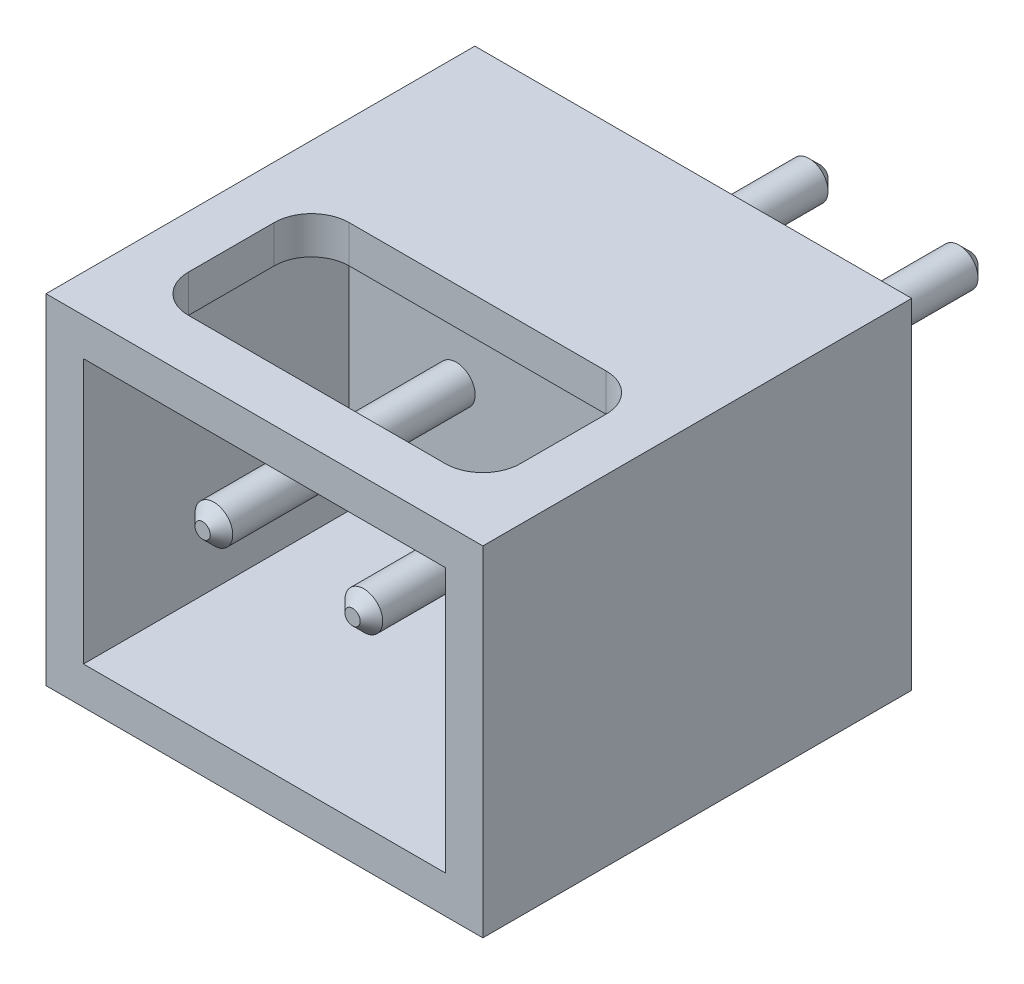
ISO-10303-21;
HEADER;
FILE_DESCRIPTION(('STEP AP214'),'2;1');
FILE_NAME('part.step','',(''),(''),'','','');
FILE_SCHEMA(('AUTOMOTIVE_DESIGN { 1 0 10303 214 1 1 1 1 }'));
ENDSEC;
DATA;
#1=APPLICATION_CONTEXT('core data for automotive mechanical design processes');
#2=APPLICATION_PROTOCOL_DEFINITION('international standard','automotive_design',2000,#1);
#3=PRODUCT_CONTEXT('',#1,'mechanical');
#4=PRODUCT('Part','Part','',(#3));
#5=PRODUCT_RELATED_PRODUCT_CATEGORY('part','',(#4));
#6=PRODUCT_DEFINITION_FORMATION('','',#4);
#7=PRODUCT_DEFINITION_CONTEXT('part definition',#1,'design');
#8=PRODUCT_DEFINITION('design','',#6,#7);
#9=PRODUCT_DEFINITION_SHAPE('','',#8);
#10=(LENGTH_UNIT() NAMED_UNIT(*) SI_UNIT(.MILLI.,.METRE.));
#11=(NAMED_UNIT(*) PLANE_ANGLE_UNIT() SI_UNIT($,.RADIAN.));
#12=(NAMED_UNIT(*) SI_UNIT($,.STERADIAN.) SOLID_ANGLE_UNIT());
#13=UNCERTAINTY_MEASURE_WITH_UNIT(LENGTH_MEASURE(1.E-05),#10,'distance_accuracy_value','');
#14=(GEOMETRIC_REPRESENTATION_CONTEXT(3) GLOBAL_UNCERTAINTY_ASSIGNED_CONTEXT((#13)) GLOBAL_UNIT_ASSIGNED_CONTEXT((#10,
#11,#12)) REPRESENTATION_CONTEXT('',''));
#15=CARTESIAN_POINT('',(0.,0.,0.));
#16=DIRECTION('',(0.,0.,1.));
#17=DIRECTION('',(1.,0.,0.));
#18=AXIS2_PLACEMENT_3D('',#15,#16,#17);
#19=CARTESIAN_POINT('',(0.,0.,7.0612));
#20=DIRECTION('',(0.,0.,1.));
#21=DIRECTION('',(1.,0.,0.));
#22=AXIS2_PLACEMENT_3D('',#19,#20,#21);
#23=PLANE('',#22);
#24=CARTESIAN_POINT('',(2.54,0.,7.0612));
#25=DIRECTION('',(0.,0.,1.));
#26=DIRECTION('',(1.,0.,0.));
#27=AXIS2_PLACEMENT_3D('',#24,#25,#26);
#28=CIRCLE('',#27,0.129495764106895);
#29=CARTESIAN_POINT('',(2.6694957641069,0.,7.0612));
#30=VERTEX_POINT('',#29);
#31=EDGE_CURVE('E19',#30,#30,#28,.F.);
#32=ORIENTED_EDGE('',*,*,#31,.F.);
#33=EDGE_LOOP('',(#32));
#34=FACE_BOUND('',#33,.T.);
#35=ADVANCED_FACE('F16',(#34),#23,.T.);
#36=CARTESIAN_POINT('',(0.,0.,7.0612));
#37=DIRECTION('',(0.,0.,1.));
#38=DIRECTION('',(1.,0.,0.));
#39=AXIS2_PLACEMENT_3D('',#36,#37,#38);
#40=PLANE('',#39);
#41=CARTESIAN_POINT('',(0.,0.,7.0612));
#42=DIRECTION('',(0.,0.,1.));
#43=DIRECTION('',(1.,0.,0.));
#44=AXIS2_PLACEMENT_3D('',#41,#42,#43);
#45=CIRCLE('',#44,0.129495764106895);
#46=CARTESIAN_POINT('',(0.129495764106895,0.,7.0612));
#47=VERTEX_POINT('',#46);
#48=EDGE_CURVE('E231',#47,#47,#45,.F.);
#49=ORIENTED_EDGE('',*,*,#48,.F.);
#50=EDGE_LOOP('',(#49));
#51=FACE_BOUND('',#50,.T.);
#52=ADVANCED_FACE('F241',(#51),#40,.T.);
#53=CARTESIAN_POINT('',(2.54,0.,6.87069476708757));
#54=DIRECTION('',(0.,0.,-1.));
#55=DIRECTION('',(-1.,0.,0.));
#56=AXIS2_PLACEMENT_3D('',#53,#54,#55);
#57=CONICAL_SURFACE('',#56,0.31999476573219,0.785381808494881);
#58=CARTESIAN_POINT('',(2.54,0.,6.87068953264856));
#59=DIRECTION('',(0.,0.,-1.));
#60=DIRECTION('',(-1.,0.,0.));
#61=AXIS2_PLACEMENT_3D('',#58,#59,#60);
#62=CIRCLE('',#61,0.31999999999999);
#63=CARTESIAN_POINT('',(2.22000000000001,0.,6.87068953264856));
#64=VERTEX_POINT('',#63);
#65=EDGE_CURVE('E229',#64,#64,#62,.T.);
#66=ORIENTED_EDGE('',*,*,#65,.F.);
#67=EDGE_LOOP('',(#66));
#68=FACE_BOUND('',#67,.T.);
#69=ORIENTED_EDGE('',*,*,#31,.T.);
#70=EDGE_LOOP('',(#69));
#71=FACE_BOUND('',#70,.T.);
#72=ADVANCED_FACE('F238',(#68,#71),#57,.T.);
#73=CARTESIAN_POINT('',(0.,0.,6.87069476708757));
#74=DIRECTION('',(0.,0.,-1.));
#75=DIRECTION('',(-1.,0.,0.));
#76=AXIS2_PLACEMENT_3D('',#73,#74,#75);
#77=CONICAL_SURFACE('',#76,0.31999476573219,0.785381808494881);
#78=CARTESIAN_POINT('',(0.,0.,6.87068953264856));
#79=DIRECTION('',(0.,0.,-1.));
#80=DIRECTION('',(-1.,0.,0.));
#81=AXIS2_PLACEMENT_3D('',#78,#79,#80);
#82=CIRCLE('',#81,0.31999999999999);
#83=CARTESIAN_POINT('',(-0.31999999999999,0.,6.87068953264856));
#84=VERTEX_POINT('',#83);
#85=EDGE_CURVE('E226',#84,#84,#82,.T.);
#86=ORIENTED_EDGE('',*,*,#85,.F.);
#87=EDGE_LOOP('',(#86));
#88=FACE_BOUND('',#87,.T.);
#89=ORIENTED_EDGE('',*,*,#48,.T.);
#90=EDGE_LOOP('',(#89));
#91=FACE_BOUND('',#90,.T.);
#92=ADVANCED_FACE('F350',(#88,#91),#77,.T.);
#93=CARTESIAN_POINT('',(2.54,0.,-3.4036));
#94=DIRECTION('',(0.,0.,1.));
#95=DIRECTION('',(1.,0.,0.));
#96=AXIS2_PLACEMENT_3D('',#93,#94,#95);
#97=CYLINDRICAL_SURFACE('',#96,0.31999999999999);
#98=ORIENTED_EDGE('',*,*,#65,.T.);
#99=EDGE_LOOP('',(#98));
#100=FACE_BOUND('',#99,.T.);
#101=CARTESIAN_POINT('',(2.54,0.,2.764282));
#102=DIRECTION('',(0.,0.,1.));
#103=DIRECTION('',(1.,0.,0.));
#104=AXIS2_PLACEMENT_3D('',#101,#102,#103);
#105=CIRCLE('',#104,0.31999999999999);
#106=CARTESIAN_POINT('',(2.85999999999999,0.,2.764282));
#107=VERTEX_POINT('',#106);
#108=EDGE_CURVE('E223',#107,#107,#105,.F.);
#109=ORIENTED_EDGE('',*,*,#108,.F.);
#110=EDGE_LOOP('',(#109));
#111=FACE_BOUND('',#110,.T.);
#112=ADVANCED_FACE('F346',(#100,#111),#97,.T.);
#113=CARTESIAN_POINT('',(0.,0.,-3.4036));
#114=DIRECTION('',(0.,0.,1.));
#115=DIRECTION('',(1.,0.,0.));
#116=AXIS2_PLACEMENT_3D('',#113,#114,#115);
#117=CYLINDRICAL_SURFACE('',#116,0.31999999999999);
#118=ORIENTED_EDGE('',*,*,#85,.T.);
#119=EDGE_LOOP('',(#118));
#120=FACE_BOUND('',#119,.T.);
#121=CARTESIAN_POINT('',(0.,0.,2.764282));
#122=DIRECTION('',(0.,0.,1.));
#123=DIRECTION('',(1.,0.,0.));
#124=AXIS2_PLACEMENT_3D('',#121,#122,#123);
#125=CIRCLE('',#124,0.31999999999999);
#126=CARTESIAN_POINT('',(0.31999999999999,0.,2.764282));
#127=VERTEX_POINT('',#126);
#128=EDGE_CURVE('E179',#127,#127,#125,.F.);
#129=ORIENTED_EDGE('',*,*,#128,.F.);
#130=EDGE_LOOP('',(#129));
#131=FACE_BOUND('',#130,.T.);
#132=ADVANCED_FACE('F342',(#120,#131),#117,.T.);
#133=CARTESIAN_POINT('',(0.,0.,-3.4036));
#134=DIRECTION('',(0.,0.,1.));
#135=DIRECTION('',(1.,0.,0.));
#136=AXIS2_PLACEMENT_3D('',#133,#134,#135);
#137=PLANE('',#136);
#138=CARTESIAN_POINT('',(2.54,0.,-3.4036));
#139=DIRECTION('',(0.,0.,1.));
#140=DIRECTION('',(1.,0.,0.));
#141=AXIS2_PLACEMENT_3D('',#138,#139,#140);
#142=CIRCLE('',#141,0.129495764110078);
#143=CARTESIAN_POINT('',(2.66949576411008,0.,-3.4036));
#144=VERTEX_POINT('',#143);
#145=EDGE_CURVE('E149',#144,#144,#142,.T.);
#146=ORIENTED_EDGE('',*,*,#145,.F.);
#147=EDGE_LOOP('',(#146));
#148=FACE_BOUND('',#147,.T.);
#149=ADVANCED_FACE('F338',(#148),#137,.F.);
#150=CARTESIAN_POINT('',(0.,0.,-3.4036));
#151=DIRECTION('',(0.,0.,1.));
#152=DIRECTION('',(1.,0.,0.));
#153=AXIS2_PLACEMENT_3D('',#150,#151,#152);
#154=PLANE('',#153);
#155=CARTESIAN_POINT('',(0.,0.,-3.4036));
#156=DIRECTION('',(0.,0.,1.));
#157=DIRECTION('',(1.,0.,0.));
#158=AXIS2_PLACEMENT_3D('',#155,#156,#157);
#159=CIRCLE('',#158,0.129495764110078);
#160=CARTESIAN_POINT('',(0.129495764110078,0.,-3.4036));
#161=VERTEX_POINT('',#160);
#162=EDGE_CURVE('E165',#161,#161,#159,.T.);
#163=ORIENTED_EDGE('',*,*,#162,.F.);
#164=EDGE_LOOP('',(#163));
#165=FACE_BOUND('',#164,.T.);
#166=ADVANCED_FACE('F334',(#165),#154,.F.);
#167=CARTESIAN_POINT('',(0.,0.,2.764282));
#168=DIRECTION('',(0.,0.,1.));
#169=DIRECTION('',(1.,0.,0.));
#170=AXIS2_PLACEMENT_3D('',#167,#168,#169);
#171=PLANE('',#170);
#172=ORIENTED_EDGE('',*,*,#128,.T.);
#173=EDGE_LOOP('',(#172));
#174=FACE_BOUND('',#173,.T.);
#175=ORIENTED_EDGE('',*,*,#108,.T.);
#176=EDGE_LOOP('',(#175));
#177=FACE_BOUND('',#176,.T.);
#178=DIRECTION('',(1.,0.,0.));
#179=VECTOR('',#178,1.);
#180=CARTESIAN_POINT('',(4.31500000000052,1.715,2.764282));
#181=LINE('',#180,#179);
#182=CARTESIAN_POINT('',(4.31500000000052,1.715,2.764282));
#183=VERTEX_POINT('',#182);
#184=CARTESIAN_POINT('',(-1.81500000000011,1.715,2.764282));
#185=VERTEX_POINT('',#184);
#186=EDGE_CURVE('E164',#183,#185,#181,.F.);
#187=ORIENTED_EDGE('',*,*,#186,.T.);
#188=DIRECTION('',(0.,1.,0.));
#189=VECTOR('',#188,1.);
#190=CARTESIAN_POINT('',(-1.81500000000011,1.715,2.764282));
#191=LINE('',#190,#189);
#192=CARTESIAN_POINT('',(-1.81500000000011,-2.7649999999991,2.764282));
#193=VERTEX_POINT('',#192);
#194=EDGE_CURVE('E367',#185,#193,#191,.F.);
#195=ORIENTED_EDGE('',*,*,#194,.T.);
#196=DIRECTION('',(1.,0.,0.));
#197=VECTOR('',#196,1.);
#198=CARTESIAN_POINT('',(-1.81500000000011,-2.7649999999991,2.764282));
#199=LINE('',#198,#197);
#200=CARTESIAN_POINT('',(4.31500000000052,-2.7649999999991,2.764282));
#201=VERTEX_POINT('',#200);
#202=EDGE_CURVE('E385',#193,#201,#199,.T.);
#203=ORIENTED_EDGE('',*,*,#202,.T.);
#204=DIRECTION('',(0.,1.,0.));
#205=VECTOR('',#204,1.);
#206=CARTESIAN_POINT('',(4.31500000000052,-2.7649999999991,2.764282));
#207=LINE('',#206,#205);
#208=EDGE_CURVE('E213',#201,#183,#207,.T.);
#209=ORIENTED_EDGE('',*,*,#208,.T.);
#210=EDGE_LOOP('',(#187,#195,#203,#209));
#211=FACE_BOUND('',#210,.T.);
#212=ADVANCED_FACE('F330',(#174,#177,#211),#171,.T.);
#213=CARTESIAN_POINT('',(-0.926000000000106,2.36859161005242,5.7404));
#214=DIRECTION('',(0.,-1.,0.));
#215=DIRECTION('',(0.,0.,-1.));
#216=AXIS2_PLACEMENT_3D('',#213,#214,#215);
#217=CYLINDRICAL_SURFACE('',#216,0.635);
#218=DIRECTION('',(0.,1.,0.));
#219=VECTOR('',#218,1.);
#220=CARTESIAN_POINT('',(-1.56100000000011,2.35,5.7404));
#221=LINE('',#220,#219);
#222=CARTESIAN_POINT('',(-1.56100000000011,1.715,5.7404));
#223=VERTEX_POINT('',#222);
#224=CARTESIAN_POINT('',(-1.56100000000011,2.35,5.7404));
#225=VERTEX_POINT('',#224);
#226=EDGE_CURVE('E177',#223,#225,#221,.T.);
#227=ORIENTED_EDGE('',*,*,#226,.T.);
#228=CARTESIAN_POINT('',(-0.926000000000106,2.35,5.7404));
#229=DIRECTION('',(0.,-1.,0.));
#230=DIRECTION('',(0.,0.,-1.));
#231=AXIS2_PLACEMENT_3D('',#228,#229,#230);
#232=CIRCLE('',#231,0.635);
#233=CARTESIAN_POINT('',(-0.926000000000106,2.35,6.3754));
#234=VERTEX_POINT('',#233);
#235=EDGE_CURVE('E206',#234,#225,#232,.T.);
#236=ORIENTED_EDGE('',*,*,#235,.F.);
#237=DIRECTION('',(0.,1.,0.));
#238=VECTOR('',#237,1.);
#239=CARTESIAN_POINT('',(-0.926000000000106,2.35,6.3754));
#240=LINE('',#239,#238);
#241=CARTESIAN_POINT('',(-0.926000000000106,1.715,6.3754));
#242=VERTEX_POINT('',#241);
#243=EDGE_CURVE('E150',#234,#242,#240,.F.);
#244=ORIENTED_EDGE('',*,*,#243,.T.);
#245=CARTESIAN_POINT('',(-0.926000000000106,1.715,5.7404));
#246=DIRECTION('',(0.,-1.,0.));
#247=DIRECTION('',(0.,0.,-1.));
#248=AXIS2_PLACEMENT_3D('',#245,#246,#247);
#249=CIRCLE('',#248,0.635);
#250=EDGE_CURVE('E156',#242,#223,#249,.T.);
#251=ORIENTED_EDGE('',*,*,#250,.T.);
#252=EDGE_LOOP('',(#227,#236,#244,#251));
#253=FACE_BOUND('',#252,.T.);
#254=ADVANCED_FACE('F326',(#253),#217,.F.);
#255=CARTESIAN_POINT('',(-1.56100000000011,2.35,3.653282));
#256=DIRECTION('',(-1.,0.,0.));
#257=DIRECTION('',(0.,0.,1.));
#258=AXIS2_PLACEMENT_3D('',#255,#256,#257);
#259=PLANE('',#258);
#260=DIRECTION('',(0.,-1.,0.));
#261=VECTOR('',#260,1.);
#262=CARTESIAN_POINT('',(-1.56100000000011,2.36859161005242,4.288282));
#263=LINE('',#262,#261);
#264=CARTESIAN_POINT('',(-1.56100000000011,1.715,4.288282));
#265=VERTEX_POINT('',#264);
#266=CARTESIAN_POINT('',(-1.56100000000011,2.35,4.288282));
#267=VERTEX_POINT('',#266);
#268=EDGE_CURVE('E175',#265,#267,#263,.F.);
#269=ORIENTED_EDGE('',*,*,#268,.T.);
#270=DIRECTION('',(0.,0.,1.));
#271=VECTOR('',#270,1.);
#272=CARTESIAN_POINT('',(-1.56100000000011,2.35,0.));
#273=LINE('',#272,#271);
#274=EDGE_CURVE('E205',#225,#267,#273,.F.);
#275=ORIENTED_EDGE('',*,*,#274,.F.);
#276=ORIENTED_EDGE('',*,*,#226,.F.);
#277=DIRECTION('',(0.,0.,1.));
#278=VECTOR('',#277,1.);
#279=CARTESIAN_POINT('',(-1.56100000000011,1.715,7.2644));
#280=LINE('',#279,#278);
#281=EDGE_CURVE('E158',#223,#265,#280,.F.);
#282=ORIENTED_EDGE('',*,*,#281,.T.);
#283=EDGE_LOOP('',(#269,#275,#276,#282));
#284=FACE_BOUND('',#283,.T.);
#285=ADVANCED_FACE('F322',(#284),#259,.F.);
#286=CARTESIAN_POINT('',(-0.926000000000106,2.36859161005242,4.288282));
#287=DIRECTION('',(0.,-1.,0.));
#288=DIRECTION('',(0.,0.,-1.));
#289=AXIS2_PLACEMENT_3D('',#286,#287,#288);
#290=CYLINDRICAL_SURFACE('',#289,0.635);
#291=DIRECTION('',(0.,1.,0.));
#292=VECTOR('',#291,1.);
#293=CARTESIAN_POINT('',(-0.926000000000106,2.35,3.653282));
#294=LINE('',#293,#292);
#295=CARTESIAN_POINT('',(-0.926000000000106,1.715,3.653282));
#296=VERTEX_POINT('',#295);
#297=CARTESIAN_POINT('',(-0.926000000000106,2.35,3.653282));
#298=VERTEX_POINT('',#297);
#299=EDGE_CURVE('E173',#296,#298,#294,.T.);
#300=ORIENTED_EDGE('',*,*,#299,.T.);
#301=CARTESIAN_POINT('',(-0.926000000000106,2.35,4.288282));
#302=DIRECTION('',(0.,-1.,0.));
#303=DIRECTION('',(0.,0.,-1.));
#304=AXIS2_PLACEMENT_3D('',#301,#302,#303);
#305=CIRCLE('',#304,0.635);
#306=EDGE_CURVE('E202',#267,#298,#305,.T.);
#307=ORIENTED_EDGE('',*,*,#306,.F.);
#308=ORIENTED_EDGE('',*,*,#268,.F.);
#309=CARTESIAN_POINT('',(-0.926000000000106,1.715,4.288282));
#310=DIRECTION('',(0.,-1.,0.));
#311=DIRECTION('',(0.,0.,-1.));
#312=AXIS2_PLACEMENT_3D('',#309,#310,#311);
#313=CIRCLE('',#312,0.635);
#314=EDGE_CURVE('E215',#265,#296,#313,.T.);
#315=ORIENTED_EDGE('',*,*,#314,.T.);
#316=EDGE_LOOP('',(#300,#307,#308,#315));
#317=FACE_BOUND('',#316,.T.);
#318=ADVANCED_FACE('F318',(#317),#290,.F.);
#319=CARTESIAN_POINT('',(4.06100000000052,2.35,3.653282));
#320=DIRECTION('',(0.,0.,-1.));
#321=DIRECTION('',(-1.,0.,0.));
#322=AXIS2_PLACEMENT_3D('',#319,#320,#321);
#323=PLANE('',#322);
#324=ORIENTED_EDGE('',*,*,#299,.F.);
#325=DIRECTION('',(1.,0.,0.));
#326=VECTOR('',#325,1.);
#327=CARTESIAN_POINT('',(4.31500000000052,1.715,3.653282));
#328=LINE('',#327,#326);
#329=CARTESIAN_POINT('',(3.42600000000052,1.715,3.653282));
#330=VERTEX_POINT('',#329);
#331=EDGE_CURVE('E214',#296,#330,#328,.T.);
#332=ORIENTED_EDGE('',*,*,#331,.T.);
#333=DIRECTION('',(0.,-1.,0.));
#334=VECTOR('',#333,1.);
#335=CARTESIAN_POINT('',(3.42600000000052,2.36859161005242,3.653282));
#336=LINE('',#335,#334);
#337=CARTESIAN_POINT('',(3.42600000000052,2.35,3.653282));
#338=VERTEX_POINT('',#337);
#339=EDGE_CURVE('E171',#330,#338,#336,.F.);
#340=ORIENTED_EDGE('',*,*,#339,.T.);
#341=DIRECTION('',(1.,0.,0.));
#342=VECTOR('',#341,1.);
#343=CARTESIAN_POINT('',(4.95000000000052,2.35,3.653282));
#344=LINE('',#343,#342);
#345=EDGE_CURVE('E201',#298,#338,#344,.T.);
#346=ORIENTED_EDGE('',*,*,#345,.F.);
#347=EDGE_LOOP('',(#324,#332,#340,#346));
#348=FACE_BOUND('',#347,.T.);
#349=ADVANCED_FACE('F314',(#348),#323,.F.);
#350=CARTESIAN_POINT('',(3.42600000000052,2.36859161005242,4.288282));
#351=DIRECTION('',(0.,-1.,0.));
#352=DIRECTION('',(0.,0.,-1.));
#353=AXIS2_PLACEMENT_3D('',#350,#351,#352);
#354=CYLINDRICAL_SURFACE('',#353,0.635);
#355=DIRECTION('',(0.,1.,0.));
#356=VECTOR('',#355,1.);
#357=CARTESIAN_POINT('',(4.06100000000052,2.35,4.288282));
#358=LINE('',#357,#356);
#359=CARTESIAN_POINT('',(4.06100000000052,1.715,4.288282));
#360=VERTEX_POINT('',#359);
#361=CARTESIAN_POINT('',(4.06100000000052,2.35,4.288282));
#362=VERTEX_POINT('',#361);
#363=EDGE_CURVE('E169',#360,#362,#358,.T.);
#364=ORIENTED_EDGE('',*,*,#363,.T.);
#365=CARTESIAN_POINT('',(3.42600000000052,2.35,4.288282));
#366=DIRECTION('',(0.,-1.,0.));
#367=DIRECTION('',(0.,0.,-1.));
#368=AXIS2_PLACEMENT_3D('',#365,#366,#367);
#369=CIRCLE('',#368,0.635);
#370=EDGE_CURVE('E198',#338,#362,#369,.T.);
#371=ORIENTED_EDGE('',*,*,#370,.F.);
#372=ORIENTED_EDGE('',*,*,#339,.F.);
#373=CARTESIAN_POINT('',(3.42600000000052,1.715,4.288282));
#374=DIRECTION('',(0.,-1.,0.));
#375=DIRECTION('',(0.,0.,-1.));
#376=AXIS2_PLACEMENT_3D('',#373,#374,#375);
#377=CIRCLE('',#376,0.635);
#378=EDGE_CURVE('E210',#330,#360,#377,.T.);
#379=ORIENTED_EDGE('',*,*,#378,.T.);
#380=EDGE_LOOP('',(#364,#371,#372,#379));
#381=FACE_BOUND('',#380,.T.);
#382=ADVANCED_FACE('F311',(#381),#354,.F.);
#383=CARTESIAN_POINT('',(4.06100000000052,2.35,6.3754));
#384=DIRECTION('',(1.,0.,0.));
#385=DIRECTION('',(0.,0.,-1.));
#386=AXIS2_PLACEMENT_3D('',#383,#384,#385);
#387=PLANE('',#386);
#388=ORIENTED_EDGE('',*,*,#363,.F.);
#389=DIRECTION('',(0.,0.,1.));
#390=VECTOR('',#389,1.);
#391=CARTESIAN_POINT('',(4.06100000000052,1.715,7.2644));
#392=LINE('',#391,#390);
#393=CARTESIAN_POINT('',(4.06100000000052,1.715,5.7404));
#394=VERTEX_POINT('',#393);
#395=EDGE_CURVE('E125',#360,#394,#392,.T.);
#396=ORIENTED_EDGE('',*,*,#395,.T.);
#397=DIRECTION('',(0.,-1.,0.));
#398=VECTOR('',#397,1.);
#399=CARTESIAN_POINT('',(4.06100000000052,2.36859161005242,5.7404));
#400=LINE('',#399,#398);
#401=CARTESIAN_POINT('',(4.06100000000052,2.35,5.7404));
#402=VERTEX_POINT('',#401);
#403=EDGE_CURVE('E136',#394,#402,#400,.F.);
#404=ORIENTED_EDGE('',*,*,#403,.T.);
#405=DIRECTION('',(0.,0.,1.));
#406=VECTOR('',#405,1.);
#407=CARTESIAN_POINT('',(4.06100000000052,2.35,0.));
#408=LINE('',#407,#406);
#409=EDGE_CURVE('E197',#362,#402,#408,.T.);
#410=ORIENTED_EDGE('',*,*,#409,.F.);
#411=EDGE_LOOP('',(#388,#396,#404,#410));
#412=FACE_BOUND('',#411,.T.);
#413=ADVANCED_FACE('F308',(#412),#387,.F.);
#414=CARTESIAN_POINT('',(3.42600000000052,2.36859161005242,5.7404));
#415=DIRECTION('',(0.,-1.,0.));
#416=DIRECTION('',(0.,0.,-1.));
#417=AXIS2_PLACEMENT_3D('',#414,#415,#416);
#418=CYLINDRICAL_SURFACE('',#417,0.635);
#419=DIRECTION('',(0.,1.,0.));
#420=VECTOR('',#419,1.);
#421=CARTESIAN_POINT('',(3.42600000000052,2.35,6.3754));
#422=LINE('',#421,#420);
#423=CARTESIAN_POINT('',(3.42600000000052,1.715,6.3754));
#424=VERTEX_POINT('',#423);
#425=CARTESIAN_POINT('',(3.42600000000052,2.35,6.3754));
#426=VERTEX_POINT('',#425);
#427=EDGE_CURVE('E134',#424,#426,#422,.T.);
#428=ORIENTED_EDGE('',*,*,#427,.T.);
#429=CARTESIAN_POINT('',(3.42600000000052,2.35,5.7404));
#430=DIRECTION('',(0.,-1.,0.));
#431=DIRECTION('',(0.,0.,-1.));
#432=AXIS2_PLACEMENT_3D('',#429,#430,#431);
#433=CIRCLE('',#432,0.635);
#434=EDGE_CURVE('E195',#402,#426,#433,.T.);
#435=ORIENTED_EDGE('',*,*,#434,.F.);
#436=ORIENTED_EDGE('',*,*,#403,.F.);
#437=CARTESIAN_POINT('',(3.42600000000052,1.715,5.7404));
#438=DIRECTION('',(0.,-1.,0.));
#439=DIRECTION('',(0.,0.,-1.));
#440=AXIS2_PLACEMENT_3D('',#437,#438,#439);
#441=CIRCLE('',#440,0.635);
#442=EDGE_CURVE('E130',#394,#424,#441,.T.);
#443=ORIENTED_EDGE('',*,*,#442,.T.);
#444=EDGE_LOOP('',(#428,#435,#436,#443));
#445=FACE_BOUND('',#444,.T.);
#446=ADVANCED_FACE('F132',(#445),#418,.F.);
#447=CARTESIAN_POINT('',(-1.56100000000011,2.35,6.3754));
#448=DIRECTION('',(0.,0.,1.));
#449=DIRECTION('',(1.,0.,0.));
#450=AXIS2_PLACEMENT_3D('',#447,#448,#449);
#451=PLANE('',#450);
#452=ORIENTED_EDGE('',*,*,#427,.F.);
#453=DIRECTION('',(1.,0.,0.));
#454=VECTOR('',#453,1.);
#455=CARTESIAN_POINT('',(4.31500000000052,1.715,6.3754));
#456=LINE('',#455,#454);
#457=EDGE_CURVE('E139',#424,#242,#456,.F.);
#458=ORIENTED_EDGE('',*,*,#457,.T.);
#459=ORIENTED_EDGE('',*,*,#243,.F.);
#460=DIRECTION('',(1.,0.,0.));
#461=VECTOR('',#460,1.);
#462=CARTESIAN_POINT('',(4.95000000000052,2.35,6.3754));
#463=LINE('',#462,#461);
#464=EDGE_CURVE('E147',#426,#234,#463,.F.);
#465=ORIENTED_EDGE('',*,*,#464,.F.);
#466=EDGE_LOOP('',(#452,#458,#459,#465));
#467=FACE_BOUND('',#466,.T.);
#468=ADVANCED_FACE('F143',(#467),#451,.F.);
#469=CARTESIAN_POINT('',(2.54,0.,-3.2130936519934));
#470=DIRECTION('',(0.,0.,1.));
#471=DIRECTION('',(1.,0.,0.));
#472=AXIS2_PLACEMENT_3D('',#469,#470,#471);
#473=CONICAL_SURFACE('',#472,0.319995880715851,0.785381808292216);
#474=CARTESIAN_POINT('',(2.54,0.,-3.21308953257452));
#475=DIRECTION('',(0.,0.,1.));
#476=DIRECTION('',(1.,0.,0.));
#477=AXIS2_PLACEMENT_3D('',#474,#475,#476);
#478=CIRCLE('',#477,0.31999999999999);
#479=CARTESIAN_POINT('',(2.85999999999999,0.,-3.21308953257452));
#480=VERTEX_POINT('',#479);
#481=EDGE_CURVE('E192',#480,#480,#478,.T.);
#482=ORIENTED_EDGE('',*,*,#481,.F.);
#483=EDGE_LOOP('',(#482));
#484=FACE_BOUND('',#483,.T.);
#485=ORIENTED_EDGE('',*,*,#145,.T.);
#486=EDGE_LOOP('',(#485));
#487=FACE_BOUND('',#486,.T.);
#488=ADVANCED_FACE('F299',(#484,#487),#473,.T.);
#489=CARTESIAN_POINT('',(0.,0.,-3.2130936519934));
#490=DIRECTION('',(0.,0.,1.));
#491=DIRECTION('',(1.,0.,0.));
#492=AXIS2_PLACEMENT_3D('',#489,#490,#491);
#493=CONICAL_SURFACE('',#492,0.319995880715851,0.785381808292216);
#494=CARTESIAN_POINT('',(0.,0.,-3.21308953257452));
#495=DIRECTION('',(0.,0.,1.));
#496=DIRECTION('',(1.,0.,0.));
#497=AXIS2_PLACEMENT_3D('',#494,#495,#496);
#498=CIRCLE('',#497,0.31999999999999);
#499=CARTESIAN_POINT('',(0.31999999999999,0.,-3.21308953257452));
#500=VERTEX_POINT('',#499);
#501=EDGE_CURVE('E188',#500,#500,#498,.T.);
#502=ORIENTED_EDGE('',*,*,#501,.F.);
#503=EDGE_LOOP('',(#502));
#504=FACE_BOUND('',#503,.T.);
#505=ORIENTED_EDGE('',*,*,#162,.T.);
#506=EDGE_LOOP('',(#505));
#507=FACE_BOUND('',#506,.T.);
#508=ADVANCED_FACE('F296',(#504,#507),#493,.T.);
#509=CARTESIAN_POINT('',(4.31500000000052,1.715,7.2644));
#510=DIRECTION('',(0.,1.,0.));
#511=DIRECTION('',(0.,0.,1.));
#512=AXIS2_PLACEMENT_3D('',#509,#510,#511);
#513=PLANE('',#512);
#514=ORIENTED_EDGE('',*,*,#331,.F.);
#515=ORIENTED_EDGE('',*,*,#314,.F.);
#516=ORIENTED_EDGE('',*,*,#281,.F.);
#517=ORIENTED_EDGE('',*,*,#250,.F.);
#518=ORIENTED_EDGE('',*,*,#457,.F.);
#519=ORIENTED_EDGE('',*,*,#442,.F.);
#520=ORIENTED_EDGE('',*,*,#395,.F.);
#521=ORIENTED_EDGE('',*,*,#378,.F.);
#522=EDGE_LOOP('',(#514,#515,#516,#517,#518,#519,#520,#521));
#523=FACE_BOUND('',#522,.T.);
#524=ORIENTED_EDGE('',*,*,#186,.F.);
#525=DIRECTION('',(0.,0.,-1.));
#526=VECTOR('',#525,1.);
#527=CARTESIAN_POINT('',(4.31500000000052,1.715,7.2644));
#528=LINE('',#527,#526);
#529=CARTESIAN_POINT('',(4.31500000000052,1.715,7.2644));
#530=VERTEX_POINT('',#529);
#531=EDGE_CURVE('E387',#183,#530,#528,.F.);
#532=ORIENTED_EDGE('',*,*,#531,.T.);
#533=DIRECTION('',(1.,0.,0.));
#534=VECTOR('',#533,1.);
#535=CARTESIAN_POINT('',(0.,1.715,7.2644));
#536=LINE('',#535,#534);
#537=CARTESIAN_POINT('',(-1.81500000000011,1.715,7.2644));
#538=VERTEX_POINT('',#537);
#539=EDGE_CURVE('E374',#538,#530,#536,.T.);
#540=ORIENTED_EDGE('',*,*,#539,.F.);
#541=DIRECTION('',(0.,0.,1.));
#542=VECTOR('',#541,1.);
#543=CARTESIAN_POINT('',(-1.81500000000011,1.715,7.2644));
#544=LINE('',#543,#542);
#545=EDGE_CURVE('E372',#538,#185,#544,.F.);
#546=ORIENTED_EDGE('',*,*,#545,.T.);
#547=EDGE_LOOP('',(#524,#532,#540,#546));
#548=FACE_BOUND('',#547,.T.);
#549=ADVANCED_FACE('F153',(#523,#548),#513,.F.);
#550=CARTESIAN_POINT('',(4.31500000000052,-2.7649999999991,7.2644));
#551=DIRECTION('',(1.,0.,0.));
#552=DIRECTION('',(0.,0.,-1.));
#553=AXIS2_PLACEMENT_3D('',#550,#551,#552);
#554=PLANE('',#553);
#555=ORIENTED_EDGE('',*,*,#208,.F.);
#556=DIRECTION('',(0.,0.,-1.));
#557=VECTOR('',#556,1.);
#558=CARTESIAN_POINT('',(4.31500000000052,-2.7649999999991,7.2644));
#559=LINE('',#558,#557);
#560=CARTESIAN_POINT('',(4.31500000000052,-2.7649999999991,7.2644));
#561=VERTEX_POINT('',#560);
#562=EDGE_CURVE('E377',#201,#561,#559,.F.);
#563=ORIENTED_EDGE('',*,*,#562,.T.);
#564=DIRECTION('',(0.,1.,0.));
#565=VECTOR('',#564,1.);
#566=CARTESIAN_POINT('',(4.31500000000052,0.,7.2644));
#567=LINE('',#566,#565);
#568=EDGE_CURVE('E415',#530,#561,#567,.F.);
#569=ORIENTED_EDGE('',*,*,#568,.F.);
#570=ORIENTED_EDGE('',*,*,#531,.F.);
#571=EDGE_LOOP('',(#555,#563,#569,#570));
#572=FACE_BOUND('',#571,.T.);
#573=ADVANCED_FACE('F289',(#572),#554,.F.);
#574=CARTESIAN_POINT('',(-1.81500000000011,-2.7649999999991,7.2644));
#575=DIRECTION('',(0.,-1.,0.));
#576=DIRECTION('',(0.,0.,-1.));
#577=AXIS2_PLACEMENT_3D('',#574,#575,#576);
#578=PLANE('',#577);
#579=ORIENTED_EDGE('',*,*,#202,.F.);
#580=DIRECTION('',(0.,0.,1.));
#581=VECTOR('',#580,1.);
#582=CARTESIAN_POINT('',(-1.81500000000011,-2.7649999999991,7.2644));
#583=LINE('',#582,#581);
#584=CARTESIAN_POINT('',(-1.81500000000011,-2.7649999999991,7.2644));
#585=VERTEX_POINT('',#584);
#586=EDGE_CURVE('E209',#193,#585,#583,.T.);
#587=ORIENTED_EDGE('',*,*,#586,.T.);
#588=DIRECTION('',(1.,0.,0.));
#589=VECTOR('',#588,1.);
#590=CARTESIAN_POINT('',(0.,-2.7649999999991,7.2644));
#591=LINE('',#590,#589);
#592=EDGE_CURVE('E418',#561,#585,#591,.F.);
#593=ORIENTED_EDGE('',*,*,#592,.F.);
#594=ORIENTED_EDGE('',*,*,#562,.F.);
#595=EDGE_LOOP('',(#579,#587,#593,#594));
#596=FACE_BOUND('',#595,.T.);
#597=ADVANCED_FACE('F285',(#596),#578,.F.);
#598=CARTESIAN_POINT('',(-1.81500000000011,1.715,7.2644));
#599=DIRECTION('',(-1.,0.,0.));
#600=DIRECTION('',(0.,0.,1.));
#601=AXIS2_PLACEMENT_3D('',#598,#599,#600);
#602=PLANE('',#601);
#603=ORIENTED_EDGE('',*,*,#194,.F.);
#604=ORIENTED_EDGE('',*,*,#545,.F.);
#605=DIRECTION('',(0.,1.,0.));
#606=VECTOR('',#605,1.);
#607=CARTESIAN_POINT('',(-1.81500000000011,0.,7.2644));
#608=LINE('',#607,#606);
#609=EDGE_CURVE('E421',#585,#538,#608,.T.);
#610=ORIENTED_EDGE('',*,*,#609,.F.);
#611=ORIENTED_EDGE('',*,*,#586,.F.);
#612=EDGE_LOOP('',(#603,#604,#610,#611));
#613=FACE_BOUND('',#612,.T.);
#614=ADVANCED_FACE('F281',(#613),#602,.F.);
#615=CARTESIAN_POINT('',(4.95000000000052,2.35,0.));
#616=DIRECTION('',(0.,1.,0.));
#617=DIRECTION('',(0.,0.,1.));
#618=AXIS2_PLACEMENT_3D('',#615,#616,#617);
#619=PLANE('',#618);
#620=ORIENTED_EDGE('',*,*,#434,.T.);
#621=ORIENTED_EDGE('',*,*,#464,.T.);
#622=ORIENTED_EDGE('',*,*,#235,.T.);
#623=ORIENTED_EDGE('',*,*,#274,.T.);
#624=ORIENTED_EDGE('',*,*,#306,.T.);
#625=ORIENTED_EDGE('',*,*,#345,.T.);
#626=ORIENTED_EDGE('',*,*,#370,.T.);
#627=ORIENTED_EDGE('',*,*,#409,.T.);
#628=EDGE_LOOP('',(#620,#621,#622,#623,#624,#625,#626,#627));
#629=FACE_BOUND('',#628,.T.);
#630=DIRECTION('',(0.,0.,-1.));
#631=VECTOR('',#630,1.);
#632=CARTESIAN_POINT('',(4.95000000000052,2.35,0.));
#633=LINE('',#632,#631);
#634=CARTESIAN_POINT('',(4.95000000000052,2.35,0.));
#635=VERTEX_POINT('',#634);
#636=CARTESIAN_POINT('',(4.95000000000052,2.35,7.2644));
#637=VERTEX_POINT('',#636);
#638=EDGE_CURVE('E191',#635,#637,#633,.F.);
#639=ORIENTED_EDGE('',*,*,#638,.F.);
#640=DIRECTION('',(1.,0.,0.));
#641=VECTOR('',#640,1.);
#642=CARTESIAN_POINT('',(0.,2.35,0.));
#643=LINE('',#642,#641);
#644=CARTESIAN_POINT('',(-2.45000000000011,2.35,0.));
#645=VERTEX_POINT('',#644);
#646=EDGE_CURVE('E187',#635,#645,#643,.F.);
#647=ORIENTED_EDGE('',*,*,#646,.T.);
#648=DIRECTION('',(0.,0.,1.));
#649=VECTOR('',#648,1.);
#650=CARTESIAN_POINT('',(-2.45000000000011,2.35,0.));
#651=LINE('',#650,#649);
#652=CARTESIAN_POINT('',(-2.45000000000011,2.35,7.2644));
#653=VERTEX_POINT('',#652);
#654=EDGE_CURVE('E426',#653,#645,#651,.F.);
#655=ORIENTED_EDGE('',*,*,#654,.F.);
#656=DIRECTION('',(1.,0.,0.));
#657=VECTOR('',#656,1.);
#658=CARTESIAN_POINT('',(0.,2.35,7.2644));
#659=LINE('',#658,#657);
#660=EDGE_CURVE('E412',#637,#653,#659,.F.);
#661=ORIENTED_EDGE('',*,*,#660,.F.);
#662=EDGE_LOOP('',(#639,#647,#655,#661));
#663=FACE_BOUND('',#662,.T.);
#664=ADVANCED_FACE('F277',(#629,#663),#619,.T.);
#665=CARTESIAN_POINT('',(2.54,0.,-3.4036));
#666=DIRECTION('',(0.,0.,1.));
#667=DIRECTION('',(1.,0.,0.));
#668=AXIS2_PLACEMENT_3D('',#665,#666,#667);
#669=CYLINDRICAL_SURFACE('',#668,0.31999999999999);
#670=CARTESIAN_POINT('',(2.54,0.,0.));
#671=DIRECTION('',(0.,0.,1.));
#672=DIRECTION('',(1.,0.,0.));
#673=AXIS2_PLACEMENT_3D('',#670,#671,#672);
#674=CIRCLE('',#673,0.31999999999999);
#675=CARTESIAN_POINT('',(2.85999999999999,0.,0.));
#676=VERTEX_POINT('',#675);
#677=EDGE_CURVE('E184',#676,#676,#674,.F.);
#678=ORIENTED_EDGE('',*,*,#677,.T.);
#679=EDGE_LOOP('',(#678));
#680=FACE_BOUND('',#679,.T.);
#681=ORIENTED_EDGE('',*,*,#481,.T.);
#682=EDGE_LOOP('',(#681));
#683=FACE_BOUND('',#682,.T.);
#684=ADVANCED_FACE('F273',(#680,#683),#669,.T.);
#685=CARTESIAN_POINT('',(0.,0.,-3.4036));
#686=DIRECTION('',(0.,0.,1.));
#687=DIRECTION('',(1.,0.,0.));
#688=AXIS2_PLACEMENT_3D('',#685,#686,#687);
#689=CYLINDRICAL_SURFACE('',#688,0.31999999999999);
#690=CARTESIAN_POINT('',(0.,0.,0.));
#691=DIRECTION('',(0.,0.,1.));
#692=DIRECTION('',(1.,0.,0.));
#693=AXIS2_PLACEMENT_3D('',#690,#691,#692);
#694=CIRCLE('',#693,0.31999999999999);
#695=CARTESIAN_POINT('',(0.31999999999999,0.,0.));
#696=VERTEX_POINT('',#695);
#697=EDGE_CURVE('E180',#696,#696,#694,.F.);
#698=ORIENTED_EDGE('',*,*,#697,.T.);
#699=EDGE_LOOP('',(#698));
#700=FACE_BOUND('',#699,.T.);
#701=ORIENTED_EDGE('',*,*,#501,.T.);
#702=EDGE_LOOP('',(#701));
#703=FACE_BOUND('',#702,.T.);
#704=ADVANCED_FACE('F269',(#700,#703),#689,.T.);
#705=CARTESIAN_POINT('',(4.95000000000052,-3.3999999999991,0.));
#706=DIRECTION('',(1.,0.,0.));
#707=DIRECTION('',(0.,0.,-1.));
#708=AXIS2_PLACEMENT_3D('',#705,#706,#707);
#709=PLANE('',#708);
#710=DIRECTION('',(0.,0.,-1.));
#711=VECTOR('',#710,1.);
#712=CARTESIAN_POINT('',(4.95000000000052,-3.3999999999991,0.));
#713=LINE('',#712,#711);
#714=CARTESIAN_POINT('',(4.95000000000052,-3.3999999999991,0.));
#715=VERTEX_POINT('',#714);
#716=CARTESIAN_POINT('',(4.95000000000052,-3.3999999999991,7.2644));
#717=VERTEX_POINT('',#716);
#718=EDGE_CURVE('E183',#715,#717,#713,.F.);
#719=ORIENTED_EDGE('',*,*,#718,.F.);
#720=DIRECTION('',(0.,1.,0.));
#721=VECTOR('',#720,1.);
#722=CARTESIAN_POINT('',(4.95000000000052,0.,0.));
#723=LINE('',#722,#721);
#724=EDGE_CURVE('E429',#715,#635,#723,.T.);
#725=ORIENTED_EDGE('',*,*,#724,.T.);
#726=ORIENTED_EDGE('',*,*,#638,.T.);
#727=DIRECTION('',(0.,1.,0.));
#728=VECTOR('',#727,1.);
#729=CARTESIAN_POINT('',(4.95000000000052,0.,7.2644));
#730=LINE('',#729,#728);
#731=EDGE_CURVE('E409',#717,#637,#730,.T.);
#732=ORIENTED_EDGE('',*,*,#731,.F.);
#733=EDGE_LOOP('',(#719,#725,#726,#732));
#734=FACE_BOUND('',#733,.T.);
#735=ADVANCED_FACE('F265',(#734),#709,.T.);
#736=CARTESIAN_POINT('',(0.,0.,7.2644));
#737=DIRECTION('',(0.,0.,1.));
#738=DIRECTION('',(1.,0.,0.));
#739=AXIS2_PLACEMENT_3D('',#736,#737,#738);
#740=PLANE('',#739);
#741=ORIENTED_EDGE('',*,*,#592,.T.);
#742=ORIENTED_EDGE('',*,*,#609,.T.);
#743=ORIENTED_EDGE('',*,*,#539,.T.);
#744=ORIENTED_EDGE('',*,*,#568,.T.);
#745=EDGE_LOOP('',(#741,#742,#743,#744));
#746=FACE_BOUND('',#745,.T.);
#747=ORIENTED_EDGE('',*,*,#660,.T.);
#748=DIRECTION('',(0.,1.,0.));
#749=VECTOR('',#748,1.);
#750=CARTESIAN_POINT('',(-2.45000000000011,2.35,7.2644));
#751=LINE('',#750,#749);
#752=CARTESIAN_POINT('',(-2.45000000000011,-3.3999999999991,7.2644));
#753=VERTEX_POINT('',#752);
#754=EDGE_CURVE('E423',#753,#653,#751,.T.);
#755=ORIENTED_EDGE('',*,*,#754,.F.);
#756=DIRECTION('',(1.,0.,0.));
#757=VECTOR('',#756,1.);
#758=CARTESIAN_POINT('',(-2.45000000000011,-3.3999999999991,7.2644));
#759=LINE('',#758,#757);
#760=EDGE_CURVE('E436',#717,#753,#759,.F.);
#761=ORIENTED_EDGE('',*,*,#760,.F.);
#762=ORIENTED_EDGE('',*,*,#731,.T.);
#763=EDGE_LOOP('',(#747,#755,#761,#762));
#764=FACE_BOUND('',#763,.T.);
#765=ADVANCED_FACE('F262',(#746,#764),#740,.T.);
#766=CARTESIAN_POINT('',(-2.45000000000011,2.35,0.));
#767=DIRECTION('',(-1.,0.,0.));
#768=DIRECTION('',(0.,0.,1.));
#769=AXIS2_PLACEMENT_3D('',#766,#767,#768);
#770=PLANE('',#769);
#771=ORIENTED_EDGE('',*,*,#654,.T.);
#772=DIRECTION('',(0.,1.,0.));
#773=VECTOR('',#772,1.);
#774=CARTESIAN_POINT('',(-2.45000000000011,0.,0.));
#775=LINE('',#774,#773);
#776=CARTESIAN_POINT('',(-2.45000000000011,-3.3999999999991,0.));
#777=VERTEX_POINT('',#776);
#778=EDGE_CURVE('E34',#645,#777,#775,.F.);
#779=ORIENTED_EDGE('',*,*,#778,.T.);
#780=DIRECTION('',(0.,0.,-1.));
#781=VECTOR('',#780,1.);
#782=CARTESIAN_POINT('',(-2.45000000000011,-3.3999999999991,0.));
#783=LINE('',#782,#781);
#784=EDGE_CURVE('E25',#753,#777,#783,.T.);
#785=ORIENTED_EDGE('',*,*,#784,.F.);
#786=ORIENTED_EDGE('',*,*,#754,.T.);
#787=EDGE_LOOP('',(#771,#779,#785,#786));
#788=FACE_BOUND('',#787,.T.);
#789=ADVANCED_FACE('F255',(#788),#770,.T.);
#790=CARTESIAN_POINT('',(0.,0.,0.));
#791=DIRECTION('',(0.,0.,1.));
#792=DIRECTION('',(1.,0.,0.));
#793=AXIS2_PLACEMENT_3D('',#790,#791,#792);
#794=PLANE('',#793);
#795=ORIENTED_EDGE('',*,*,#697,.F.);
#796=EDGE_LOOP('',(#795));
#797=FACE_BOUND('',#796,.T.);
#798=ORIENTED_EDGE('',*,*,#677,.F.);
#799=EDGE_LOOP('',(#798));
#800=FACE_BOUND('',#799,.T.);
#801=ORIENTED_EDGE('',*,*,#724,.F.);
#802=DIRECTION('',(1.,0.,0.));
#803=VECTOR('',#802,1.);
#804=CARTESIAN_POINT('',(-2.45000000000011,-3.3999999999991,0.));
#805=LINE('',#804,#803);
#806=EDGE_CURVE('E11',#777,#715,#805,.T.);
#807=ORIENTED_EDGE('',*,*,#806,.F.);
#808=ORIENTED_EDGE('',*,*,#778,.F.);
#809=ORIENTED_EDGE('',*,*,#646,.F.);
#810=EDGE_LOOP('',(#801,#807,#808,#809));
#811=FACE_BOUND('',#810,.T.);
#812=ADVANCED_FACE('F249',(#797,#800,#811),#794,.F.);
#813=CARTESIAN_POINT('',(-2.45000000000011,-3.3999999999991,0.));
#814=DIRECTION('',(0.,-1.,0.));
#815=DIRECTION('',(0.,0.,-1.));
#816=AXIS2_PLACEMENT_3D('',#813,#814,#815);
#817=PLANE('',#816);
#818=ORIENTED_EDGE('',*,*,#784,.T.);
#819=ORIENTED_EDGE('',*,*,#806,.T.);
#820=ORIENTED_EDGE('',*,*,#718,.T.);
#821=ORIENTED_EDGE('',*,*,#760,.T.);
#822=EDGE_LOOP('',(#818,#819,#820,#821));
#823=FACE_BOUND('',#822,.T.);
#824=ADVANCED_FACE('F247',(#823),#817,.T.);
#825=CLOSED_SHELL('',(#35,#52,#72,#92,#112,#132,#149,#166,#212,#254,#285,#318,#349,#382,#413,
#446,#468,#488,#508,#549,#573,#597,#614,#664,#684,#704,#735,#765,#789,#812,#824));
#826=MANIFOLD_SOLID_BREP('B1',#825);
#827=ADVANCED_BREP_SHAPE_REPRESENTATION('',(#18,#826),#14);
#828=SHAPE_DEFINITION_REPRESENTATION(#9,#827);
ENDSEC;
END-ISO-10303-21;
